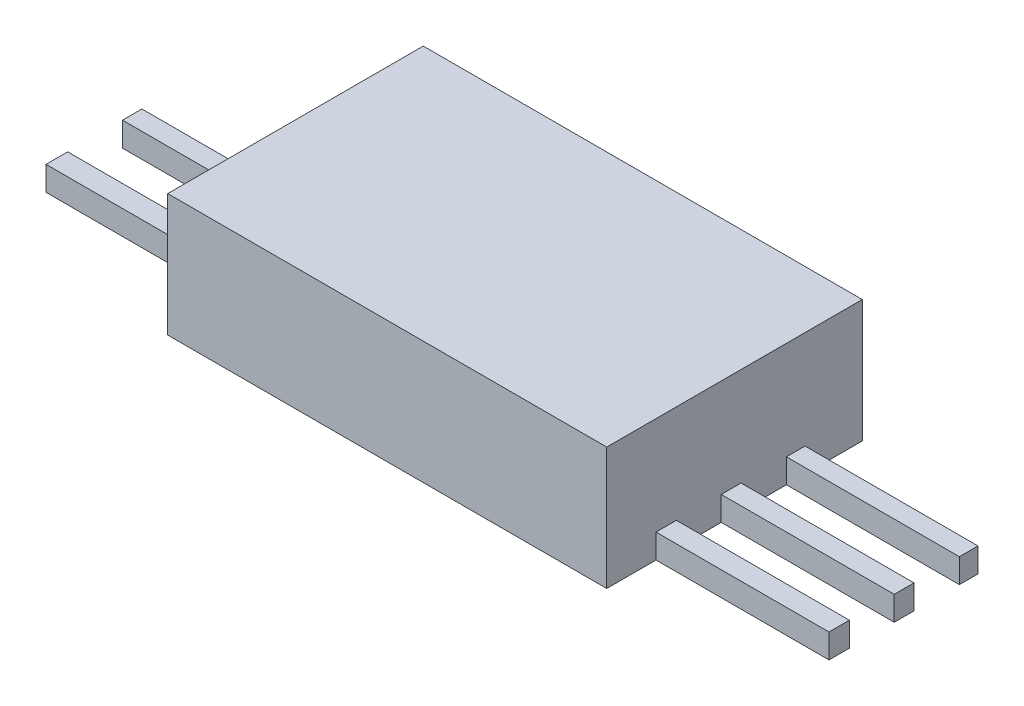
ISO-10303-21;
HEADER;
FILE_DESCRIPTION(('STEP AP214'),'2;1');
FILE_NAME('part.step','',(''),(''),'','','');
FILE_SCHEMA(('AUTOMOTIVE_DESIGN { 1 0 10303 214 1 1 1 1 }'));
ENDSEC;
DATA;
#1=APPLICATION_CONTEXT('core data for automotive mechanical design processes');
#2=APPLICATION_PROTOCOL_DEFINITION('international standard','automotive_design',2000,#1);
#3=PRODUCT_CONTEXT('',#1,'mechanical');
#4=PRODUCT('Part','Part','',(#3));
#5=PRODUCT_RELATED_PRODUCT_CATEGORY('part','',(#4));
#6=PRODUCT_DEFINITION_FORMATION('','',#4);
#7=PRODUCT_DEFINITION_CONTEXT('part definition',#1,'design');
#8=PRODUCT_DEFINITION('design','',#6,#7);
#9=PRODUCT_DEFINITION_SHAPE('','',#8);
#10=(LENGTH_UNIT() NAMED_UNIT(*) SI_UNIT(.MILLI.,.METRE.));
#11=(NAMED_UNIT(*) PLANE_ANGLE_UNIT() SI_UNIT($,.RADIAN.));
#12=(NAMED_UNIT(*) SI_UNIT($,.STERADIAN.) SOLID_ANGLE_UNIT());
#13=UNCERTAINTY_MEASURE_WITH_UNIT(LENGTH_MEASURE(1.E-05),#10,'distance_accuracy_value','');
#14=(GEOMETRIC_REPRESENTATION_CONTEXT(3) GLOBAL_UNCERTAINTY_ASSIGNED_CONTEXT((#13)) GLOBAL_UNIT_ASSIGNED_CONTEXT((#10,
#11,#12)) REPRESENTATION_CONTEXT('',''));
#15=CARTESIAN_POINT('',(0.,0.,0.));
#16=DIRECTION('',(0.,0.,1.));
#17=DIRECTION('',(1.,0.,0.));
#18=AXIS2_PLACEMENT_3D('',#15,#16,#17);
#19=CARTESIAN_POINT('',(0.,18.7,0.));
#20=DIRECTION('',(1.,0.,0.));
#21=DIRECTION('',(0.,0.,-1.));
#22=AXIS2_PLACEMENT_3D('',#19,#20,#21);
#23=PLANE('',#22);
#24=DIRECTION('',(0.,-1.,0.));
#25=VECTOR('',#24,1.);
#26=CARTESIAN_POINT('',(0.,3.69999999999999,-24.2117591638023));
#27=LINE('',#26,#25);
#28=CARTESIAN_POINT('',(0.,3.69999999999999,-24.2117591638023));
#29=VERTEX_POINT('',#28);
#30=CARTESIAN_POINT('',(0.,0.,-24.2117591638023));
#31=VERTEX_POINT('',#30);
#32=EDGE_CURVE('E293',#29,#31,#27,.T.);
#33=ORIENTED_EDGE('',*,*,#32,.F.);
#34=DIRECTION('',(0.,0.,1.));
#35=VECTOR('',#34,1.);
#36=CARTESIAN_POINT('',(0.,3.69999999999999,-21.254378412054));
#37=LINE('',#36,#35);
#38=CARTESIAN_POINT('',(0.,3.69999999999999,-21.254378412054));
#39=VERTEX_POINT('',#38);
#40=EDGE_CURVE('E401',#29,#39,#37,.T.);
#41=ORIENTED_EDGE('',*,*,#40,.T.);
#42=DIRECTION('',(0.,-1.,0.));
#43=VECTOR('',#42,1.);
#44=CARTESIAN_POINT('',(0.,3.69999999999999,-21.254378412054));
#45=LINE('',#44,#43);
#46=CARTESIAN_POINT('',(0.,0.,-21.254378412054));
#47=VERTEX_POINT('',#46);
#48=EDGE_CURVE('E377',#39,#47,#45,.T.);
#49=ORIENTED_EDGE('',*,*,#48,.T.);
#50=DIRECTION('',(0.,0.,1.));
#51=VECTOR('',#50,1.);
#52=CARTESIAN_POINT('',(0.,0.,0.));
#53=LINE('',#52,#51);
#54=CARTESIAN_POINT('',(0.,0.,-12.8834871316818));
#55=VERTEX_POINT('',#54);
#56=EDGE_CURVE('E358',#47,#55,#53,.T.);
#57=ORIENTED_EDGE('',*,*,#56,.T.);
#58=DIRECTION('',(0.,-1.,0.));
#59=VECTOR('',#58,1.);
#60=CARTESIAN_POINT('',(0.,3.69999999999999,-12.8834871316818));
#61=LINE('',#60,#59);
#62=CARTESIAN_POINT('',(0.,3.69999999999999,-12.8834871316818));
#63=VERTEX_POINT('',#62);
#64=EDGE_CURVE('E334',#63,#55,#61,.T.);
#65=ORIENTED_EDGE('',*,*,#64,.F.);
#66=DIRECTION('',(0.,0.,1.));
#67=VECTOR('',#66,1.);
#68=CARTESIAN_POINT('',(0.,3.69999999999999,-9.5752306975227));
#69=LINE('',#68,#67);
#70=CARTESIAN_POINT('',(0.,3.69999999999999,-9.5752306975227));
#71=VERTEX_POINT('',#70);
#72=EDGE_CURVE('E310',#63,#71,#69,.T.);
#73=ORIENTED_EDGE('',*,*,#72,.T.);
#74=DIRECTION('',(0.,-1.,0.));
#75=VECTOR('',#74,1.);
#76=CARTESIAN_POINT('',(0.,3.69999999999999,-9.5752306975227));
#77=LINE('',#76,#75);
#78=CARTESIAN_POINT('',(0.,0.,-9.5752306975227));
#79=VERTEX_POINT('',#78);
#80=EDGE_CURVE('E323',#71,#79,#77,.T.);
#81=ORIENTED_EDGE('',*,*,#80,.T.);
#82=CARTESIAN_POINT('',(0.,0.,0.));
#83=VERTEX_POINT('',#82);
#84=EDGE_CURVE('E340',#79,#83,#53,.T.);
#85=ORIENTED_EDGE('',*,*,#84,.T.);
#86=DIRECTION('',(0.,-1.,0.));
#87=VECTOR('',#86,1.);
#88=CARTESIAN_POINT('',(0.,18.7,0.));
#89=LINE('',#88,#87);
#90=CARTESIAN_POINT('',(0.,18.7,0.));
#91=VERTEX_POINT('',#90);
#92=EDGE_CURVE('E11',#91,#83,#89,.T.);
#93=ORIENTED_EDGE('',*,*,#92,.F.);
#94=DIRECTION('',(0.,0.,1.));
#95=VECTOR('',#94,1.);
#96=CARTESIAN_POINT('',(0.,18.7,0.));
#97=LINE('',#96,#95);
#98=CARTESIAN_POINT('',(0.,18.7,-39.));
#99=VERTEX_POINT('',#98);
#100=EDGE_CURVE('E254',#99,#91,#97,.T.);
#101=ORIENTED_EDGE('',*,*,#100,.F.);
#102=DIRECTION('',(0.,-1.,0.));
#103=VECTOR('',#102,1.);
#104=CARTESIAN_POINT('',(0.,18.7,-39.));
#105=LINE('',#104,#103);
#106=CARTESIAN_POINT('',(0.,0.,-39.));
#107=VERTEX_POINT('',#106);
#108=EDGE_CURVE('E251',#99,#107,#105,.T.);
#109=ORIENTED_EDGE('',*,*,#108,.T.);
#110=EDGE_CURVE('E352',#107,#31,#53,.T.);
#111=ORIENTED_EDGE('',*,*,#110,.T.);
#112=EDGE_LOOP('',(#33,#41,#49,#57,#65,#73,#81,#85,#93,#101,#109,#111));
#113=FACE_BOUND('',#112,.T.);
#114=ADVANCED_FACE('F44',(#113),#23,.F.);
#115=CARTESIAN_POINT('',(67.,18.7,0.));
#116=DIRECTION('',(-1.,0.,0.));
#117=DIRECTION('',(0.,0.,1.));
#118=AXIS2_PLACEMENT_3D('',#115,#116,#117);
#119=PLANE('',#118);
#120=DIRECTION('',(0.,-1.,0.));
#121=VECTOR('',#120,1.);
#122=CARTESIAN_POINT('',(67.,3.69999999999999,-7.52010170054509));
#123=LINE('',#122,#121);
#124=CARTESIAN_POINT('',(67.,3.69999999999999,-7.52010170054509));
#125=VERTEX_POINT('',#124);
#126=CARTESIAN_POINT('',(67.,0.,-7.52010170054509));
#127=VERTEX_POINT('',#126);
#128=EDGE_CURVE('E286',#125,#127,#123,.T.);
#129=ORIENTED_EDGE('',*,*,#128,.F.);
#130=DIRECTION('',(0.,0.,-1.));
#131=VECTOR('',#130,1.);
#132=CARTESIAN_POINT('',(67.,3.69999999999999,-7.52010170054509));
#133=LINE('',#132,#131);
#134=CARTESIAN_POINT('',(67.,3.69999999999999,-10.6278577447551));
#135=VERTEX_POINT('',#134);
#136=EDGE_CURVE('E282',#125,#135,#133,.T.);
#137=ORIENTED_EDGE('',*,*,#136,.T.);
#138=DIRECTION('',(0.,-1.,0.));
#139=VECTOR('',#138,1.);
#140=CARTESIAN_POINT('',(67.,3.69999999999999,-10.6278577447551));
#141=LINE('',#140,#139);
#142=CARTESIAN_POINT('',(67.,0.,-10.6278577447551));
#143=VERTEX_POINT('',#142);
#144=EDGE_CURVE('E240',#135,#143,#141,.T.);
#145=ORIENTED_EDGE('',*,*,#144,.T.);
#146=DIRECTION('',(0.,0.,-1.));
#147=VECTOR('',#146,1.);
#148=CARTESIAN_POINT('',(67.,0.,0.));
#149=LINE('',#148,#147);
#150=CARTESIAN_POINT('',(67.,0.,-17.4748934344549));
#151=VERTEX_POINT('',#150);
#152=EDGE_CURVE('E226',#143,#151,#149,.T.);
#153=ORIENTED_EDGE('',*,*,#152,.T.);
#154=DIRECTION('',(0.,-1.,0.));
#155=VECTOR('',#154,1.);
#156=CARTESIAN_POINT('',(67.,3.69999999999999,-17.4748934344549));
#157=LINE('',#156,#155);
#158=CARTESIAN_POINT('',(67.,3.69999999999999,-17.4748934344549));
#159=VERTEX_POINT('',#158);
#160=EDGE_CURVE('E210',#159,#151,#157,.T.);
#161=ORIENTED_EDGE('',*,*,#160,.F.);
#162=DIRECTION('',(0.,0.,-1.));
#163=VECTOR('',#162,1.);
#164=CARTESIAN_POINT('',(67.,3.69999999999999,-17.4748934344549));
#165=LINE('',#164,#163);
#166=CARTESIAN_POINT('',(67.,3.69999999999999,-20.4937606156538));
#167=VERTEX_POINT('',#166);
#168=EDGE_CURVE('E231',#159,#167,#165,.T.);
#169=ORIENTED_EDGE('',*,*,#168,.T.);
#170=DIRECTION('',(0.,-1.,0.));
#171=VECTOR('',#170,1.);
#172=CARTESIAN_POINT('',(67.,3.69999999999999,-20.4937606156538));
#173=LINE('',#172,#171);
#174=CARTESIAN_POINT('',(67.,0.,-20.4937606156538));
#175=VERTEX_POINT('',#174);
#176=EDGE_CURVE('E425',#167,#175,#173,.T.);
#177=ORIENTED_EDGE('',*,*,#176,.T.);
#178=CARTESIAN_POINT('',(67.,0.,-27.4193970901688));
#179=VERTEX_POINT('',#178);
#180=EDGE_CURVE('E238',#175,#179,#149,.T.);
#181=ORIENTED_EDGE('',*,*,#180,.T.);
#182=DIRECTION('',(0.,-1.,0.));
#183=VECTOR('',#182,1.);
#184=CARTESIAN_POINT('',(67.,3.69999999999999,-27.4193970901688));
#185=LINE('',#184,#183);
#186=CARTESIAN_POINT('',(67.,3.69999999999999,-27.4193970901688));
#187=VERTEX_POINT('',#186);
#188=EDGE_CURVE('E441',#187,#179,#185,.T.);
#189=ORIENTED_EDGE('',*,*,#188,.F.);
#190=DIRECTION('',(0.,0.,-1.));
#191=VECTOR('',#190,1.);
#192=CARTESIAN_POINT('',(67.,3.69999999999999,-27.4193970901688));
#193=LINE('',#192,#191);
#194=CARTESIAN_POINT('',(67.,3.69999999999999,-30.2606838489442));
#195=VERTEX_POINT('',#194);
#196=EDGE_CURVE('E451',#187,#195,#193,.T.);
#197=ORIENTED_EDGE('',*,*,#196,.T.);
#198=DIRECTION('',(0.,-1.,0.));
#199=VECTOR('',#198,1.);
#200=CARTESIAN_POINT('',(67.,3.69999999999999,-30.2606838489442));
#201=LINE('',#200,#199);
#202=CARTESIAN_POINT('',(67.,0.,-30.2606838489442));
#203=VERTEX_POINT('',#202);
#204=EDGE_CURVE('E435',#195,#203,#201,.T.);
#205=ORIENTED_EDGE('',*,*,#204,.T.);
#206=CARTESIAN_POINT('',(67.,0.,-39.));
#207=VERTEX_POINT('',#206);
#208=EDGE_CURVE('E247',#203,#207,#149,.T.);
#209=ORIENTED_EDGE('',*,*,#208,.T.);
#210=DIRECTION('',(0.,-1.,0.));
#211=VECTOR('',#210,1.);
#212=CARTESIAN_POINT('',(67.,18.7,-39.));
#213=LINE('',#212,#211);
#214=CARTESIAN_POINT('',(67.,18.7,-39.));
#215=VERTEX_POINT('',#214);
#216=EDGE_CURVE('E260',#215,#207,#213,.T.);
#217=ORIENTED_EDGE('',*,*,#216,.F.);
#218=DIRECTION('',(0.,0.,-1.));
#219=VECTOR('',#218,1.);
#220=CARTESIAN_POINT('',(67.,18.7,0.));
#221=LINE('',#220,#219);
#222=CARTESIAN_POINT('',(67.,18.7,0.));
#223=VERTEX_POINT('',#222);
#224=EDGE_CURVE('E267',#223,#215,#221,.T.);
#225=ORIENTED_EDGE('',*,*,#224,.F.);
#226=DIRECTION('',(0.,-1.,0.));
#227=VECTOR('',#226,1.);
#228=CARTESIAN_POINT('',(67.,18.7,0.));
#229=LINE('',#228,#227);
#230=CARTESIAN_POINT('',(67.,0.,0.));
#231=VERTEX_POINT('',#230);
#232=EDGE_CURVE('E52',#223,#231,#229,.T.);
#233=ORIENTED_EDGE('',*,*,#232,.T.);
#234=EDGE_CURVE('E236',#231,#127,#149,.T.);
#235=ORIENTED_EDGE('',*,*,#234,.T.);
#236=EDGE_LOOP('',(#129,#137,#145,#153,#161,#169,#177,#181,#189,#197,#205,#209,#217,#225,#233,#235));
#237=FACE_BOUND('',#236,.T.);
#238=ADVANCED_FACE('F234',(#237),#119,.F.);
#239=CARTESIAN_POINT('',(0.,18.7,0.));
#240=DIRECTION('',(0.,0.,-1.));
#241=DIRECTION('',(-1.,0.,0.));
#242=AXIS2_PLACEMENT_3D('',#239,#240,#241);
#243=PLANE('',#242);
#244=DIRECTION('',(1.,0.,0.));
#245=VECTOR('',#244,1.);
#246=CARTESIAN_POINT('',(0.,0.,0.));
#247=LINE('',#246,#245);
#248=EDGE_CURVE('E248',#83,#231,#247,.T.);
#249=ORIENTED_EDGE('',*,*,#248,.T.);
#250=ORIENTED_EDGE('',*,*,#232,.F.);
#251=DIRECTION('',(1.,0.,0.));
#252=VECTOR('',#251,1.);
#253=CARTESIAN_POINT('',(0.,18.7,0.));
#254=LINE('',#253,#252);
#255=EDGE_CURVE('E350',#91,#223,#254,.T.);
#256=ORIENTED_EDGE('',*,*,#255,.F.);
#257=ORIENTED_EDGE('',*,*,#92,.T.);
#258=EDGE_LOOP('',(#249,#250,#256,#257));
#259=FACE_BOUND('',#258,.T.);
#260=ADVANCED_FACE('F510',(#259),#243,.F.);
#261=CARTESIAN_POINT('',(0.,18.7,-39.));
#262=DIRECTION('',(0.,0.,1.));
#263=DIRECTION('',(1.,0.,0.));
#264=AXIS2_PLACEMENT_3D('',#261,#262,#263);
#265=PLANE('',#264);
#266=DIRECTION('',(-1.,0.,0.));
#267=VECTOR('',#266,1.);
#268=CARTESIAN_POINT('',(0.,0.,-39.));
#269=LINE('',#268,#267);
#270=EDGE_CURVE('E241',#207,#107,#269,.T.);
#271=ORIENTED_EDGE('',*,*,#270,.T.);
#272=ORIENTED_EDGE('',*,*,#108,.F.);
#273=DIRECTION('',(-1.,0.,0.));
#274=VECTOR('',#273,1.);
#275=CARTESIAN_POINT('',(0.,18.7,-39.));
#276=LINE('',#275,#274);
#277=EDGE_CURVE('E259',#215,#99,#276,.T.);
#278=ORIENTED_EDGE('',*,*,#277,.F.);
#279=ORIENTED_EDGE('',*,*,#216,.T.);
#280=EDGE_LOOP('',(#271,#272,#278,#279));
#281=FACE_BOUND('',#280,.T.);
#282=ADVANCED_FACE('F513',(#281),#265,.F.);
#283=CARTESIAN_POINT('',(0.,18.7,0.));
#284=DIRECTION('',(0.,-1.,0.));
#285=DIRECTION('',(0.,0.,-1.));
#286=AXIS2_PLACEMENT_3D('',#283,#284,#285);
#287=PLANE('',#286);
#288=ORIENTED_EDGE('',*,*,#100,.T.);
#289=ORIENTED_EDGE('',*,*,#255,.T.);
#290=ORIENTED_EDGE('',*,*,#224,.T.);
#291=ORIENTED_EDGE('',*,*,#277,.T.);
#292=EDGE_LOOP('',(#288,#289,#290,#291));
#293=FACE_BOUND('',#292,.T.);
#294=ADVANCED_FACE('F520',(#293),#287,.F.);
#295=CARTESIAN_POINT('',(0.,0.,0.));
#296=DIRECTION('',(0.,-1.,0.));
#297=DIRECTION('',(0.,0.,-1.));
#298=AXIS2_PLACEMENT_3D('',#295,#296,#297);
#299=PLANE('',#298);
#300=ORIENTED_EDGE('',*,*,#110,.F.);
#301=ORIENTED_EDGE('',*,*,#270,.F.);
#302=ORIENTED_EDGE('',*,*,#208,.F.);
#303=DIRECTION('',(1.,0.,0.));
#304=VECTOR('',#303,1.);
#305=CARTESIAN_POINT('',(67.,0.,-30.2606838489442));
#306=LINE('',#305,#304);
#307=CARTESIAN_POINT('',(93.3994914972742,0.,-30.2606838489442));
#308=VERTEX_POINT('',#307);
#309=EDGE_CURVE('E216',#203,#308,#306,.T.);
#310=ORIENTED_EDGE('',*,*,#309,.T.);
#311=DIRECTION('',(0.,0.,1.));
#312=VECTOR('',#311,1.);
#313=CARTESIAN_POINT('',(93.3994914972742,0.,-27.4193970901688));
#314=LINE('',#313,#312);
#315=CARTESIAN_POINT('',(93.3994914972742,0.,-27.4193970901688));
#316=VERTEX_POINT('',#315);
#317=EDGE_CURVE('E449',#308,#316,#314,.T.);
#318=ORIENTED_EDGE('',*,*,#317,.T.);
#319=DIRECTION('',(-1.,0.,0.));
#320=VECTOR('',#319,1.);
#321=CARTESIAN_POINT('',(67.,0.,-27.4193970901688));
#322=LINE('',#321,#320);
#323=EDGE_CURVE('E446',#316,#179,#322,.T.);
#324=ORIENTED_EDGE('',*,*,#323,.T.);
#325=ORIENTED_EDGE('',*,*,#180,.F.);
#326=DIRECTION('',(1.,0.,0.));
#327=VECTOR('',#326,1.);
#328=CARTESIAN_POINT('',(67.,0.,-20.4937606156538));
#329=LINE('',#328,#327);
#330=CARTESIAN_POINT('',(93.3994914972742,0.,-20.4937606156538));
#331=VERTEX_POINT('',#330);
#332=EDGE_CURVE('E415',#175,#331,#329,.T.);
#333=ORIENTED_EDGE('',*,*,#332,.T.);
#334=DIRECTION('',(0.,0.,1.));
#335=VECTOR('',#334,1.);
#336=CARTESIAN_POINT('',(93.3994914972742,0.,-17.4748934344549));
#337=LINE('',#336,#335);
#338=CARTESIAN_POINT('',(93.3994914972742,0.,-17.4748934344549));
#339=VERTEX_POINT('',#338);
#340=EDGE_CURVE('E227',#331,#339,#337,.T.);
#341=ORIENTED_EDGE('',*,*,#340,.T.);
#342=DIRECTION('',(-1.,0.,0.));
#343=VECTOR('',#342,1.);
#344=CARTESIAN_POINT('',(67.,0.,-17.4748934344549));
#345=LINE('',#344,#343);
#346=EDGE_CURVE('E206',#339,#151,#345,.T.);
#347=ORIENTED_EDGE('',*,*,#346,.T.);
#348=ORIENTED_EDGE('',*,*,#152,.F.);
#349=DIRECTION('',(1.,0.,0.));
#350=VECTOR('',#349,1.);
#351=CARTESIAN_POINT('',(67.,0.,-10.6278577447551));
#352=LINE('',#351,#350);
#353=CARTESIAN_POINT('',(93.3994914972742,0.,-10.6278577447551));
#354=VERTEX_POINT('',#353);
#355=EDGE_CURVE('E283',#143,#354,#352,.T.);
#356=ORIENTED_EDGE('',*,*,#355,.T.);
#357=DIRECTION('',(0.,0.,1.));
#358=VECTOR('',#357,1.);
#359=CARTESIAN_POINT('',(93.3994914972742,0.,-7.52010170054509));
#360=LINE('',#359,#358);
#361=CARTESIAN_POINT('',(93.3994914972742,0.,-7.52010170054509));
#362=VERTEX_POINT('',#361);
#363=EDGE_CURVE('E277',#354,#362,#360,.T.);
#364=ORIENTED_EDGE('',*,*,#363,.T.);
#365=DIRECTION('',(-1.,0.,0.));
#366=VECTOR('',#365,1.);
#367=CARTESIAN_POINT('',(67.,0.,-7.52010170054509));
#368=LINE('',#367,#366);
#369=EDGE_CURVE('E276',#362,#127,#368,.T.);
#370=ORIENTED_EDGE('',*,*,#369,.T.);
#371=ORIENTED_EDGE('',*,*,#234,.F.);
#372=ORIENTED_EDGE('',*,*,#248,.F.);
#373=ORIENTED_EDGE('',*,*,#84,.F.);
#374=DIRECTION('',(-1.,0.,0.));
#375=VECTOR('',#374,1.);
#376=CARTESIAN_POINT('',(0.,0.,-9.5752306975227));
#377=LINE('',#376,#375);
#378=CARTESIAN_POINT('',(-28.1538699093283,0.,-9.5752306975227));
#379=VERTEX_POINT('',#378);
#380=EDGE_CURVE('E58',#79,#379,#377,.T.);
#381=ORIENTED_EDGE('',*,*,#380,.T.);
#382=DIRECTION('',(0.,0.,-1.));
#383=VECTOR('',#382,1.);
#384=CARTESIAN_POINT('',(-28.1538699093283,0.,-9.5752306975227));
#385=LINE('',#384,#383);
#386=CARTESIAN_POINT('',(-28.1538699093283,0.,-12.8834871316818));
#387=VERTEX_POINT('',#386);
#388=EDGE_CURVE('E330',#379,#387,#385,.T.);
#389=ORIENTED_EDGE('',*,*,#388,.T.);
#390=DIRECTION('',(1.,0.,0.));
#391=VECTOR('',#390,1.);
#392=CARTESIAN_POINT('',(0.,0.,-12.8834871316818));
#393=LINE('',#392,#391);
#394=EDGE_CURVE('E315',#387,#55,#393,.T.);
#395=ORIENTED_EDGE('',*,*,#394,.T.);
#396=ORIENTED_EDGE('',*,*,#56,.F.);
#397=DIRECTION('',(-1.,0.,0.));
#398=VECTOR('',#397,1.);
#399=CARTESIAN_POINT('',(0.,0.,-21.254378412054));
#400=LINE('',#399,#398);
#401=CARTESIAN_POINT('',(-28.1538699093283,0.,-21.254378412054));
#402=VERTEX_POINT('',#401);
#403=EDGE_CURVE('E66',#47,#402,#400,.T.);
#404=ORIENTED_EDGE('',*,*,#403,.T.);
#405=DIRECTION('',(0.,0.,-1.));
#406=VECTOR('',#405,1.);
#407=CARTESIAN_POINT('',(-28.1538699093283,0.,-21.254378412054));
#408=LINE('',#407,#406);
#409=CARTESIAN_POINT('',(-28.1538699093283,0.,-24.2117591638023));
#410=VERTEX_POINT('',#409);
#411=EDGE_CURVE('E376',#402,#410,#408,.T.);
#412=ORIENTED_EDGE('',*,*,#411,.T.);
#413=DIRECTION('',(1.,0.,0.));
#414=VECTOR('',#413,1.);
#415=CARTESIAN_POINT('',(0.,0.,-24.2117591638023));
#416=LINE('',#415,#414);
#417=EDGE_CURVE('E383',#410,#31,#416,.T.);
#418=ORIENTED_EDGE('',*,*,#417,.T.);
#419=EDGE_LOOP('',(#300,#301,#302,#310,#318,#324,#325,#333,#341,#347,#348,#356,#364,#370,#371,
#372,#373,#381,#389,#395,#396,#404,#412,#418));
#420=FACE_BOUND('',#419,.T.);
#421=ADVANCED_FACE('F222',(#420),#299,.T.);
#422=CARTESIAN_POINT('',(67.,3.69999999999999,-27.4193970901688));
#423=DIRECTION('',(0.,0.,1.));
#424=DIRECTION('',(1.,0.,0.));
#425=AXIS2_PLACEMENT_3D('',#422,#423,#424);
#426=PLANE('',#425);
#427=ORIENTED_EDGE('',*,*,#323,.F.);
#428=DIRECTION('',(0.,-1.,0.));
#429=VECTOR('',#428,1.);
#430=CARTESIAN_POINT('',(93.3994914972742,3.69999999999999,-27.4193970901688));
#431=LINE('',#430,#429);
#432=CARTESIAN_POINT('',(93.3994914972742,3.69999999999999,-27.4193970901688));
#433=VERTEX_POINT('',#432);
#434=EDGE_CURVE('E439',#433,#316,#431,.T.);
#435=ORIENTED_EDGE('',*,*,#434,.F.);
#436=DIRECTION('',(-1.,0.,0.));
#437=VECTOR('',#436,1.);
#438=CARTESIAN_POINT('',(67.,3.69999999999999,-27.4193970901688));
#439=LINE('',#438,#437);
#440=EDGE_CURVE('E438',#433,#187,#439,.T.);
#441=ORIENTED_EDGE('',*,*,#440,.T.);
#442=ORIENTED_EDGE('',*,*,#188,.T.);
#443=EDGE_LOOP('',(#427,#435,#441,#442));
#444=FACE_BOUND('',#443,.T.);
#445=ADVANCED_FACE('F518',(#444),#426,.T.);
#446=CARTESIAN_POINT('',(93.3994914972742,3.69999999999999,-27.4193970901688));
#447=DIRECTION('',(1.,0.,0.));
#448=DIRECTION('',(0.,0.,-1.));
#449=AXIS2_PLACEMENT_3D('',#446,#447,#448);
#450=PLANE('',#449);
#451=ORIENTED_EDGE('',*,*,#317,.F.);
#452=DIRECTION('',(0.,-1.,0.));
#453=VECTOR('',#452,1.);
#454=CARTESIAN_POINT('',(93.3994914972742,3.69999999999999,-30.2606838489442));
#455=LINE('',#454,#453);
#456=CARTESIAN_POINT('',(93.3994914972742,3.69999999999999,-30.2606838489442));
#457=VERTEX_POINT('',#456);
#458=EDGE_CURVE('E437',#457,#308,#455,.T.);
#459=ORIENTED_EDGE('',*,*,#458,.F.);
#460=DIRECTION('',(0.,0.,1.));
#461=VECTOR('',#460,1.);
#462=CARTESIAN_POINT('',(93.3994914972742,3.69999999999999,-27.4193970901688));
#463=LINE('',#462,#461);
#464=EDGE_CURVE('E462',#457,#433,#463,.T.);
#465=ORIENTED_EDGE('',*,*,#464,.T.);
#466=ORIENTED_EDGE('',*,*,#434,.T.);
#467=EDGE_LOOP('',(#451,#459,#465,#466));
#468=FACE_BOUND('',#467,.T.);
#469=ADVANCED_FACE('F673',(#468),#450,.T.);
#470=CARTESIAN_POINT('',(67.,3.69999999999999,-30.2606838489442));
#471=DIRECTION('',(0.,0.,-1.));
#472=DIRECTION('',(-1.,0.,0.));
#473=AXIS2_PLACEMENT_3D('',#470,#471,#472);
#474=PLANE('',#473);
#475=ORIENTED_EDGE('',*,*,#309,.F.);
#476=ORIENTED_EDGE('',*,*,#204,.F.);
#477=DIRECTION('',(1.,0.,0.));
#478=VECTOR('',#477,1.);
#479=CARTESIAN_POINT('',(67.,3.69999999999999,-30.2606838489442));
#480=LINE('',#479,#478);
#481=EDGE_CURVE('E463',#195,#457,#480,.T.);
#482=ORIENTED_EDGE('',*,*,#481,.T.);
#483=ORIENTED_EDGE('',*,*,#458,.T.);
#484=EDGE_LOOP('',(#475,#476,#482,#483));
#485=FACE_BOUND('',#484,.T.);
#486=ADVANCED_FACE('F661',(#485),#474,.T.);
#487=CARTESIAN_POINT('',(0.,3.69999999999999,0.));
#488=DIRECTION('',(0.,-1.,0.));
#489=DIRECTION('',(0.,0.,-1.));
#490=AXIS2_PLACEMENT_3D('',#487,#488,#489);
#491=PLANE('',#490);
#492=ORIENTED_EDGE('',*,*,#196,.F.);
#493=ORIENTED_EDGE('',*,*,#440,.F.);
#494=ORIENTED_EDGE('',*,*,#464,.F.);
#495=ORIENTED_EDGE('',*,*,#481,.F.);
#496=EDGE_LOOP('',(#492,#493,#494,#495));
#497=FACE_BOUND('',#496,.T.);
#498=ADVANCED_FACE('F654',(#497),#491,.F.);
#499=CARTESIAN_POINT('',(67.,3.69999999999999,-17.4748934344549));
#500=DIRECTION('',(0.,0.,1.));
#501=DIRECTION('',(1.,0.,0.));
#502=AXIS2_PLACEMENT_3D('',#499,#500,#501);
#503=PLANE('',#502);
#504=ORIENTED_EDGE('',*,*,#346,.F.);
#505=DIRECTION('',(0.,-1.,0.));
#506=VECTOR('',#505,1.);
#507=CARTESIAN_POINT('',(93.3994914972742,3.69999999999999,-17.4748934344549));
#508=LINE('',#507,#506);
#509=CARTESIAN_POINT('',(93.3994914972742,3.69999999999999,-17.4748934344549));
#510=VERTEX_POINT('',#509);
#511=EDGE_CURVE('E220',#510,#339,#508,.T.);
#512=ORIENTED_EDGE('',*,*,#511,.F.);
#513=DIRECTION('',(-1.,0.,0.));
#514=VECTOR('',#513,1.);
#515=CARTESIAN_POINT('',(67.,3.69999999999999,-17.4748934344549));
#516=LINE('',#515,#514);
#517=EDGE_CURVE('E212',#510,#159,#516,.T.);
#518=ORIENTED_EDGE('',*,*,#517,.T.);
#519=ORIENTED_EDGE('',*,*,#160,.T.);
#520=EDGE_LOOP('',(#504,#512,#518,#519));
#521=FACE_BOUND('',#520,.T.);
#522=ADVANCED_FACE('F209',(#521),#503,.T.);
#523=CARTESIAN_POINT('',(93.3994914972742,3.69999999999999,-17.4748934344549));
#524=DIRECTION('',(1.,0.,0.));
#525=DIRECTION('',(0.,0.,-1.));
#526=AXIS2_PLACEMENT_3D('',#523,#524,#525);
#527=PLANE('',#526);
#528=ORIENTED_EDGE('',*,*,#340,.F.);
#529=DIRECTION('',(0.,-1.,0.));
#530=VECTOR('',#529,1.);
#531=CARTESIAN_POINT('',(93.3994914972742,3.69999999999999,-20.4937606156538));
#532=LINE('',#531,#530);
#533=CARTESIAN_POINT('',(93.3994914972742,3.69999999999999,-20.4937606156538));
#534=VERTEX_POINT('',#533);
#535=EDGE_CURVE('E748',#534,#331,#532,.T.);
#536=ORIENTED_EDGE('',*,*,#535,.F.);
#537=DIRECTION('',(0.,0.,1.));
#538=VECTOR('',#537,1.);
#539=CARTESIAN_POINT('',(93.3994914972742,3.69999999999999,-17.4748934344549));
#540=LINE('',#539,#538);
#541=EDGE_CURVE('E422',#534,#510,#540,.T.);
#542=ORIENTED_EDGE('',*,*,#541,.T.);
#543=ORIENTED_EDGE('',*,*,#511,.T.);
#544=EDGE_LOOP('',(#528,#536,#542,#543));
#545=FACE_BOUND('',#544,.T.);
#546=ADVANCED_FACE('F634',(#545),#527,.T.);
#547=CARTESIAN_POINT('',(67.,3.69999999999999,-20.4937606156538));
#548=DIRECTION('',(0.,0.,-1.));
#549=DIRECTION('',(-1.,0.,0.));
#550=AXIS2_PLACEMENT_3D('',#547,#548,#549);
#551=PLANE('',#550);
#552=ORIENTED_EDGE('',*,*,#332,.F.);
#553=ORIENTED_EDGE('',*,*,#176,.F.);
#554=DIRECTION('',(1.,0.,0.));
#555=VECTOR('',#554,1.);
#556=CARTESIAN_POINT('',(67.,3.69999999999999,-20.4937606156538));
#557=LINE('',#556,#555);
#558=EDGE_CURVE('E427',#167,#534,#557,.T.);
#559=ORIENTED_EDGE('',*,*,#558,.T.);
#560=ORIENTED_EDGE('',*,*,#535,.T.);
#561=EDGE_LOOP('',(#552,#553,#559,#560));
#562=FACE_BOUND('',#561,.T.);
#563=ADVANCED_FACE('F622',(#562),#551,.T.);
#564=CARTESIAN_POINT('',(0.,3.69999999999999,0.));
#565=DIRECTION('',(0.,-1.,0.));
#566=DIRECTION('',(0.,0.,-1.));
#567=AXIS2_PLACEMENT_3D('',#564,#565,#566);
#568=PLANE('',#567);
#569=ORIENTED_EDGE('',*,*,#168,.F.);
#570=ORIENTED_EDGE('',*,*,#517,.F.);
#571=ORIENTED_EDGE('',*,*,#541,.F.);
#572=ORIENTED_EDGE('',*,*,#558,.F.);
#573=EDGE_LOOP('',(#569,#570,#571,#572));
#574=FACE_BOUND('',#573,.T.);
#575=ADVANCED_FACE('F543',(#574),#568,.F.);
#576=CARTESIAN_POINT('',(67.,3.69999999999999,-7.52010170054509));
#577=DIRECTION('',(0.,0.,1.));
#578=DIRECTION('',(1.,0.,0.));
#579=AXIS2_PLACEMENT_3D('',#576,#577,#578);
#580=PLANE('',#579);
#581=ORIENTED_EDGE('',*,*,#369,.F.);
#582=DIRECTION('',(0.,-1.,0.));
#583=VECTOR('',#582,1.);
#584=CARTESIAN_POINT('',(93.3994914972742,3.69999999999999,-7.52010170054509));
#585=LINE('',#584,#583);
#586=CARTESIAN_POINT('',(93.3994914972742,3.69999999999999,-7.52010170054509));
#587=VERTEX_POINT('',#586);
#588=EDGE_CURVE('E408',#587,#362,#585,.T.);
#589=ORIENTED_EDGE('',*,*,#588,.F.);
#590=DIRECTION('',(-1.,0.,0.));
#591=VECTOR('',#590,1.);
#592=CARTESIAN_POINT('',(67.,3.69999999999999,-7.52010170054509));
#593=LINE('',#592,#591);
#594=EDGE_CURVE('E297',#587,#125,#593,.T.);
#595=ORIENTED_EDGE('',*,*,#594,.T.);
#596=ORIENTED_EDGE('',*,*,#128,.T.);
#597=EDGE_LOOP('',(#581,#589,#595,#596));
#598=FACE_BOUND('',#597,.T.);
#599=ADVANCED_FACE('F537',(#598),#580,.T.);
#600=CARTESIAN_POINT('',(93.3994914972742,3.69999999999999,-7.52010170054509));
#601=DIRECTION('',(1.,0.,0.));
#602=DIRECTION('',(0.,0.,-1.));
#603=AXIS2_PLACEMENT_3D('',#600,#601,#602);
#604=PLANE('',#603);
#605=ORIENTED_EDGE('',*,*,#363,.F.);
#606=DIRECTION('',(0.,-1.,0.));
#607=VECTOR('',#606,1.);
#608=CARTESIAN_POINT('',(93.3994914972742,3.69999999999999,-10.6278577447551));
#609=LINE('',#608,#607);
#610=CARTESIAN_POINT('',(93.3994914972742,3.69999999999999,-10.6278577447551));
#611=VERTEX_POINT('',#610);
#612=EDGE_CURVE('E406',#611,#354,#609,.T.);
#613=ORIENTED_EDGE('',*,*,#612,.F.);
#614=DIRECTION('',(0.,0.,1.));
#615=VECTOR('',#614,1.);
#616=CARTESIAN_POINT('',(93.3994914972742,3.69999999999999,-7.52010170054509));
#617=LINE('',#616,#615);
#618=EDGE_CURVE('E296',#611,#587,#617,.T.);
#619=ORIENTED_EDGE('',*,*,#618,.T.);
#620=ORIENTED_EDGE('',*,*,#588,.T.);
#621=EDGE_LOOP('',(#605,#613,#619,#620));
#622=FACE_BOUND('',#621,.T.);
#623=ADVANCED_FACE('F545',(#622),#604,.T.);
#624=CARTESIAN_POINT('',(67.,3.69999999999999,-10.6278577447551));
#625=DIRECTION('',(0.,0.,-1.));
#626=DIRECTION('',(-1.,0.,0.));
#627=AXIS2_PLACEMENT_3D('',#624,#625,#626);
#628=PLANE('',#627);
#629=ORIENTED_EDGE('',*,*,#355,.F.);
#630=ORIENTED_EDGE('',*,*,#144,.F.);
#631=DIRECTION('',(1.,0.,0.));
#632=VECTOR('',#631,1.);
#633=CARTESIAN_POINT('',(67.,3.69999999999999,-10.6278577447551));
#634=LINE('',#633,#632);
#635=EDGE_CURVE('E290',#135,#611,#634,.T.);
#636=ORIENTED_EDGE('',*,*,#635,.T.);
#637=ORIENTED_EDGE('',*,*,#612,.T.);
#638=EDGE_LOOP('',(#629,#630,#636,#637));
#639=FACE_BOUND('',#638,.T.);
#640=ADVANCED_FACE('F540',(#639),#628,.T.);
#641=CARTESIAN_POINT('',(0.,3.69999999999999,0.));
#642=DIRECTION('',(0.,-1.,0.));
#643=DIRECTION('',(0.,0.,-1.));
#644=AXIS2_PLACEMENT_3D('',#641,#642,#643);
#645=PLANE('',#644);
#646=ORIENTED_EDGE('',*,*,#136,.F.);
#647=ORIENTED_EDGE('',*,*,#594,.F.);
#648=ORIENTED_EDGE('',*,*,#618,.F.);
#649=ORIENTED_EDGE('',*,*,#635,.F.);
#650=EDGE_LOOP('',(#646,#647,#648,#649));
#651=FACE_BOUND('',#650,.T.);
#652=ADVANCED_FACE('F533',(#651),#645,.F.);
#653=CARTESIAN_POINT('',(0.,3.69999999999999,-12.8834871316818));
#654=DIRECTION('',(0.,0.,-1.));
#655=DIRECTION('',(-1.,0.,0.));
#656=AXIS2_PLACEMENT_3D('',#653,#654,#655);
#657=PLANE('',#656);
#658=ORIENTED_EDGE('',*,*,#394,.F.);
#659=DIRECTION('',(0.,-1.,0.));
#660=VECTOR('',#659,1.);
#661=CARTESIAN_POINT('',(-28.1538699093283,3.69999999999999,-12.8834871316818));
#662=LINE('',#661,#660);
#663=CARTESIAN_POINT('',(-28.1538699093283,3.69999999999999,-12.8834871316818));
#664=VERTEX_POINT('',#663);
#665=EDGE_CURVE('E336',#664,#387,#662,.T.);
#666=ORIENTED_EDGE('',*,*,#665,.F.);
#667=DIRECTION('',(1.,0.,0.));
#668=VECTOR('',#667,1.);
#669=CARTESIAN_POINT('',(0.,3.69999999999999,-12.8834871316818));
#670=LINE('',#669,#668);
#671=EDGE_CURVE('E319',#664,#63,#670,.T.);
#672=ORIENTED_EDGE('',*,*,#671,.T.);
#673=ORIENTED_EDGE('',*,*,#64,.T.);
#674=EDGE_LOOP('',(#658,#666,#672,#673));
#675=FACE_BOUND('',#674,.T.);
#676=ADVANCED_FACE('F375',(#675),#657,.T.);
#677=CARTESIAN_POINT('',(-28.1538699093283,3.69999999999999,-9.5752306975227));
#678=DIRECTION('',(-1.,0.,0.));
#679=DIRECTION('',(0.,0.,1.));
#680=AXIS2_PLACEMENT_3D('',#677,#678,#679);
#681=PLANE('',#680);
#682=ORIENTED_EDGE('',*,*,#388,.F.);
#683=DIRECTION('',(0.,-1.,0.));
#684=VECTOR('',#683,1.);
#685=CARTESIAN_POINT('',(-28.1538699093283,3.69999999999999,-9.5752306975227));
#686=LINE('',#685,#684);
#687=CARTESIAN_POINT('',(-28.1538699093283,3.69999999999999,-9.5752306975227));
#688=VERTEX_POINT('',#687);
#689=EDGE_CURVE('E342',#688,#379,#686,.T.);
#690=ORIENTED_EDGE('',*,*,#689,.F.);
#691=DIRECTION('',(0.,0.,-1.));
#692=VECTOR('',#691,1.);
#693=CARTESIAN_POINT('',(-28.1538699093283,3.69999999999999,-9.5752306975227));
#694=LINE('',#693,#692);
#695=EDGE_CURVE('E316',#688,#664,#694,.T.);
#696=ORIENTED_EDGE('',*,*,#695,.T.);
#697=ORIENTED_EDGE('',*,*,#665,.T.);
#698=EDGE_LOOP('',(#682,#690,#696,#697));
#699=FACE_BOUND('',#698,.T.);
#700=ADVANCED_FACE('F528',(#699),#681,.T.);
#701=CARTESIAN_POINT('',(0.,3.69999999999999,-9.5752306975227));
#702=DIRECTION('',(0.,0.,1.));
#703=DIRECTION('',(1.,0.,0.));
#704=AXIS2_PLACEMENT_3D('',#701,#702,#703);
#705=PLANE('',#704);
#706=ORIENTED_EDGE('',*,*,#380,.F.);
#707=ORIENTED_EDGE('',*,*,#80,.F.);
#708=DIRECTION('',(-1.,0.,0.));
#709=VECTOR('',#708,1.);
#710=CARTESIAN_POINT('',(0.,3.69999999999999,-9.5752306975227));
#711=LINE('',#710,#709);
#712=EDGE_CURVE('E311',#71,#688,#711,.T.);
#713=ORIENTED_EDGE('',*,*,#712,.T.);
#714=ORIENTED_EDGE('',*,*,#689,.T.);
#715=EDGE_LOOP('',(#706,#707,#713,#714));
#716=FACE_BOUND('',#715,.T.);
#717=ADVANCED_FACE('F523',(#716),#705,.T.);
#718=CARTESIAN_POINT('',(0.,3.69999999999999,0.));
#719=DIRECTION('',(0.,1.,0.));
#720=DIRECTION('',(0.,0.,1.));
#721=AXIS2_PLACEMENT_3D('',#718,#719,#720);
#722=PLANE('',#721);
#723=ORIENTED_EDGE('',*,*,#72,.F.);
#724=ORIENTED_EDGE('',*,*,#671,.F.);
#725=ORIENTED_EDGE('',*,*,#695,.F.);
#726=ORIENTED_EDGE('',*,*,#712,.F.);
#727=EDGE_LOOP('',(#723,#724,#725,#726));
#728=FACE_BOUND('',#727,.T.);
#729=ADVANCED_FACE('F499',(#728),#722,.T.);
#730=CARTESIAN_POINT('',(0.,3.69999999999999,-24.2117591638023));
#731=DIRECTION('',(0.,0.,-1.));
#732=DIRECTION('',(-1.,0.,0.));
#733=AXIS2_PLACEMENT_3D('',#730,#731,#732);
#734=PLANE('',#733);
#735=ORIENTED_EDGE('',*,*,#417,.F.);
#736=DIRECTION('',(0.,-1.,0.));
#737=VECTOR('',#736,1.);
#738=CARTESIAN_POINT('',(-28.1538699093283,3.69999999999999,-24.2117591638023));
#739=LINE('',#738,#737);
#740=CARTESIAN_POINT('',(-28.1538699093283,3.69999999999999,-24.2117591638023));
#741=VERTEX_POINT('',#740);
#742=EDGE_CURVE('E480',#741,#410,#739,.T.);
#743=ORIENTED_EDGE('',*,*,#742,.F.);
#744=DIRECTION('',(1.,0.,0.));
#745=VECTOR('',#744,1.);
#746=CARTESIAN_POINT('',(0.,3.69999999999999,-24.2117591638023));
#747=LINE('',#746,#745);
#748=EDGE_CURVE('E389',#741,#29,#747,.T.);
#749=ORIENTED_EDGE('',*,*,#748,.T.);
#750=ORIENTED_EDGE('',*,*,#32,.T.);
#751=EDGE_LOOP('',(#735,#743,#749,#750));
#752=FACE_BOUND('',#751,.T.);
#753=ADVANCED_FACE('F485',(#752),#734,.T.);
#754=CARTESIAN_POINT('',(-28.1538699093283,3.69999999999999,-21.254378412054));
#755=DIRECTION('',(-1.,0.,0.));
#756=DIRECTION('',(0.,0.,1.));
#757=AXIS2_PLACEMENT_3D('',#754,#755,#756);
#758=PLANE('',#757);
#759=ORIENTED_EDGE('',*,*,#411,.F.);
#760=DIRECTION('',(0.,-1.,0.));
#761=VECTOR('',#760,1.);
#762=CARTESIAN_POINT('',(-28.1538699093283,3.69999999999999,-21.254378412054));
#763=LINE('',#762,#761);
#764=CARTESIAN_POINT('',(-28.1538699093283,3.69999999999999,-21.254378412054));
#765=VERTEX_POINT('',#764);
#766=EDGE_CURVE('E474',#765,#402,#763,.T.);
#767=ORIENTED_EDGE('',*,*,#766,.F.);
#768=DIRECTION('',(0.,0.,-1.));
#769=VECTOR('',#768,1.);
#770=CARTESIAN_POINT('',(-28.1538699093283,3.69999999999999,-21.254378412054));
#771=LINE('',#770,#769);
#772=EDGE_CURVE('E391',#765,#741,#771,.T.);
#773=ORIENTED_EDGE('',*,*,#772,.T.);
#774=ORIENTED_EDGE('',*,*,#742,.T.);
#775=EDGE_LOOP('',(#759,#767,#773,#774));
#776=FACE_BOUND('',#775,.T.);
#777=ADVANCED_FACE('F495',(#776),#758,.T.);
#778=CARTESIAN_POINT('',(0.,3.69999999999999,-21.254378412054));
#779=DIRECTION('',(0.,0.,1.));
#780=DIRECTION('',(1.,0.,0.));
#781=AXIS2_PLACEMENT_3D('',#778,#779,#780);
#782=PLANE('',#781);
#783=ORIENTED_EDGE('',*,*,#403,.F.);
#784=ORIENTED_EDGE('',*,*,#48,.F.);
#785=DIRECTION('',(-1.,0.,0.));
#786=VECTOR('',#785,1.);
#787=CARTESIAN_POINT('',(0.,3.69999999999999,-21.254378412054));
#788=LINE('',#787,#786);
#789=EDGE_CURVE('E400',#39,#765,#788,.T.);
#790=ORIENTED_EDGE('',*,*,#789,.T.);
#791=ORIENTED_EDGE('',*,*,#766,.T.);
#792=EDGE_LOOP('',(#783,#784,#790,#791));
#793=FACE_BOUND('',#792,.T.);
#794=ADVANCED_FACE('F487',(#793),#782,.T.);
#795=CARTESIAN_POINT('',(0.,3.69999999999999,0.));
#796=DIRECTION('',(0.,1.,0.));
#797=DIRECTION('',(0.,0.,1.));
#798=AXIS2_PLACEMENT_3D('',#795,#796,#797);
#799=PLANE('',#798);
#800=ORIENTED_EDGE('',*,*,#40,.F.);
#801=ORIENTED_EDGE('',*,*,#748,.F.);
#802=ORIENTED_EDGE('',*,*,#772,.F.);
#803=ORIENTED_EDGE('',*,*,#789,.F.);
#804=EDGE_LOOP('',(#800,#801,#802,#803));
#805=FACE_BOUND('',#804,.T.);
#806=ADVANCED_FACE('F486',(#805),#799,.T.);
#807=CLOSED_SHELL('',(#114,#238,#260,#282,#294,#421,#445,#469,#486,#498,#522,#546,#563,#575,
#599,#623,#640,#652,#676,#700,#717,#729,#753,#777,#794,#806));
#808=MANIFOLD_SOLID_BREP('B2',#807);
#809=ADVANCED_BREP_SHAPE_REPRESENTATION('',(#18,#808),#14);
#810=SHAPE_DEFINITION_REPRESENTATION(#9,#809);
ENDSEC;
END-ISO-10303-21;
